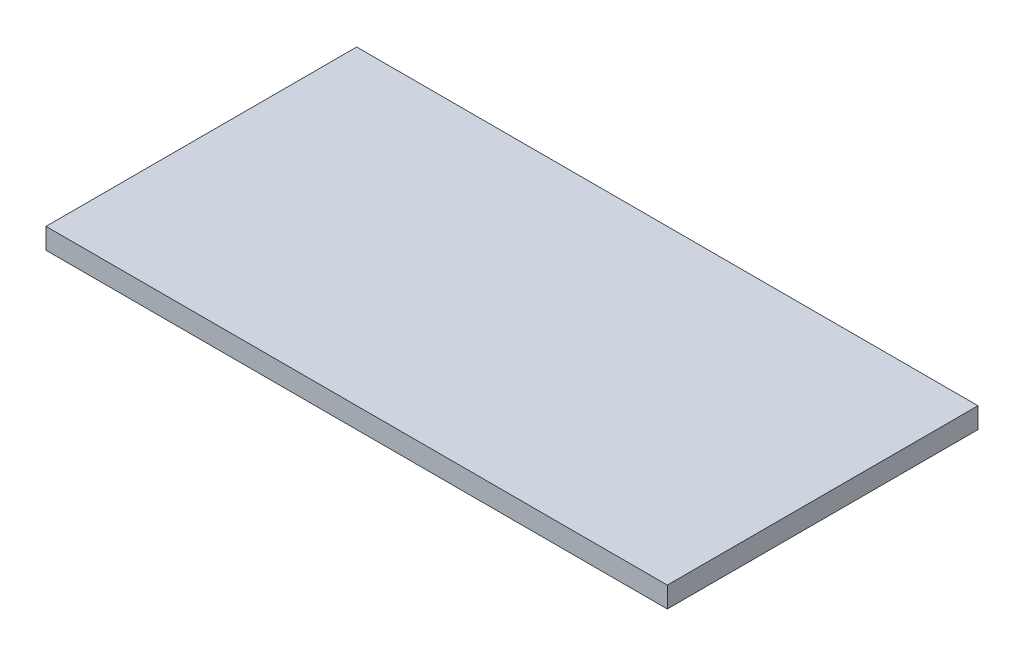
ISO-10303-21;
HEADER;
FILE_DESCRIPTION(('STEP AP214'),'2;1');
FILE_NAME('part.step','',(''),(''),'','','');
FILE_SCHEMA(('AUTOMOTIVE_DESIGN { 1 0 10303 214 1 1 1 1 }'));
ENDSEC;
DATA;
#1=APPLICATION_CONTEXT('core data for automotive mechanical design processes');
#2=APPLICATION_PROTOCOL_DEFINITION('international standard','automotive_design',2000,#1);
#3=PRODUCT_CONTEXT('',#1,'mechanical');
#4=PRODUCT('Part','Part','',(#3));
#5=PRODUCT_RELATED_PRODUCT_CATEGORY('part','',(#4));
#6=PRODUCT_DEFINITION_FORMATION('','',#4);
#7=PRODUCT_DEFINITION_CONTEXT('part definition',#1,'design');
#8=PRODUCT_DEFINITION('design','',#6,#7);
#9=PRODUCT_DEFINITION_SHAPE('','',#8);
#10=(LENGTH_UNIT() NAMED_UNIT(*) SI_UNIT(.MILLI.,.METRE.));
#11=(NAMED_UNIT(*) PLANE_ANGLE_UNIT() SI_UNIT($,.RADIAN.));
#12=(NAMED_UNIT(*) SI_UNIT($,.STERADIAN.) SOLID_ANGLE_UNIT());
#13=UNCERTAINTY_MEASURE_WITH_UNIT(LENGTH_MEASURE(1.E-05),#10,'distance_accuracy_value','');
#14=(GEOMETRIC_REPRESENTATION_CONTEXT(3) GLOBAL_UNCERTAINTY_ASSIGNED_CONTEXT((#13)) GLOBAL_UNIT_ASSIGNED_CONTEXT((#10,
#11,#12)) REPRESENTATION_CONTEXT('',''));
#15=CARTESIAN_POINT('',(0.,0.,0.));
#16=DIRECTION('',(0.,0.,1.));
#17=DIRECTION('',(1.,0.,0.));
#18=AXIS2_PLACEMENT_3D('',#15,#16,#17);
#19=CARTESIAN_POINT('',(-8.287841191067,1.,-3.8833746898263));
#20=DIRECTION('',(1.,0.,0.));
#21=DIRECTION('',(0.,0.,-1.));
#22=AXIS2_PLACEMENT_3D('',#19,#20,#21);
#23=PLANE('',#22);
#24=DIRECTION('',(0.,0.,1.));
#25=VECTOR('',#24,1.);
#26=CARTESIAN_POINT('',(-8.287841191067,0.,-3.8833746898263));
#27=LINE('',#26,#25);
#28=CARTESIAN_POINT('',(-8.287841191067,0.,-3.8833746898263));
#29=VERTEX_POINT('',#28);
#30=CARTESIAN_POINT('',(-8.287841191067,0.,11.1166253101737));
#31=VERTEX_POINT('',#30);
#32=EDGE_CURVE('E97',#29,#31,#27,.T.);
#33=ORIENTED_EDGE('',*,*,#32,.T.);
#34=DIRECTION('',(0.,-1.,0.));
#35=VECTOR('',#34,1.);
#36=CARTESIAN_POINT('',(-8.287841191067,1.,11.1166253101737));
#37=LINE('',#36,#35);
#38=CARTESIAN_POINT('',(-8.287841191067,1.,11.1166253101737));
#39=VERTEX_POINT('',#38);
#40=EDGE_CURVE('E11',#39,#31,#37,.T.);
#41=ORIENTED_EDGE('',*,*,#40,.F.);
#42=DIRECTION('',(0.,0.,1.));
#43=VECTOR('',#42,1.);
#44=CARTESIAN_POINT('',(-8.287841191067,1.,-3.8833746898263));
#45=LINE('',#44,#43);
#46=CARTESIAN_POINT('',(-8.287841191067,1.,-3.8833746898263));
#47=VERTEX_POINT('',#46);
#48=EDGE_CURVE('E85',#47,#39,#45,.T.);
#49=ORIENTED_EDGE('',*,*,#48,.F.);
#50=DIRECTION('',(0.,-1.,0.));
#51=VECTOR('',#50,1.);
#52=CARTESIAN_POINT('',(-8.287841191067,1.,-3.8833746898263));
#53=LINE('',#52,#51);
#54=EDGE_CURVE('E93',#47,#29,#53,.T.);
#55=ORIENTED_EDGE('',*,*,#54,.T.);
#56=EDGE_LOOP('',(#33,#41,#49,#55));
#57=FACE_BOUND('',#56,.T.);
#58=ADVANCED_FACE('F34',(#57),#23,.F.);
#59=CARTESIAN_POINT('',(-8.287841191067,1.,11.1166253101737));
#60=DIRECTION('',(0.,0.,-1.));
#61=DIRECTION('',(-1.,0.,0.));
#62=AXIS2_PLACEMENT_3D('',#59,#60,#61);
#63=PLANE('',#62);
#64=DIRECTION('',(1.,0.,0.));
#65=VECTOR('',#64,1.);
#66=CARTESIAN_POINT('',(-8.287841191067,0.,11.1166253101737));
#67=LINE('',#66,#65);
#68=CARTESIAN_POINT('',(21.712158808933,0.,11.1166253101737));
#69=VERTEX_POINT('',#68);
#70=EDGE_CURVE('E89',#31,#69,#67,.T.);
#71=ORIENTED_EDGE('',*,*,#70,.T.);
#72=DIRECTION('',(0.,-1.,0.));
#73=VECTOR('',#72,1.);
#74=CARTESIAN_POINT('',(21.712158808933,1.,11.1166253101737));
#75=LINE('',#74,#73);
#76=CARTESIAN_POINT('',(21.712158808933,1.,11.1166253101737));
#77=VERTEX_POINT('',#76);
#78=EDGE_CURVE('E42',#77,#69,#75,.T.);
#79=ORIENTED_EDGE('',*,*,#78,.F.);
#80=DIRECTION('',(1.,0.,0.));
#81=VECTOR('',#80,1.);
#82=CARTESIAN_POINT('',(-8.287841191067,1.,11.1166253101737));
#83=LINE('',#82,#81);
#84=EDGE_CURVE('E80',#39,#77,#83,.T.);
#85=ORIENTED_EDGE('',*,*,#84,.F.);
#86=ORIENTED_EDGE('',*,*,#40,.T.);
#87=EDGE_LOOP('',(#71,#79,#85,#86));
#88=FACE_BOUND('',#87,.T.);
#89=ADVANCED_FACE('F88',(#88),#63,.F.);
#90=CARTESIAN_POINT('',(21.712158808933,1.,-3.8833746898263));
#91=DIRECTION('',(-1.,0.,0.));
#92=DIRECTION('',(0.,0.,1.));
#93=AXIS2_PLACEMENT_3D('',#90,#91,#92);
#94=PLANE('',#93);
#95=DIRECTION('',(0.,0.,-1.));
#96=VECTOR('',#95,1.);
#97=CARTESIAN_POINT('',(21.712158808933,0.,-3.8833746898263));
#98=LINE('',#97,#96);
#99=CARTESIAN_POINT('',(21.712158808933,0.,-3.8833746898263));
#100=VERTEX_POINT('',#99);
#101=EDGE_CURVE('E67',#69,#100,#98,.T.);
#102=ORIENTED_EDGE('',*,*,#101,.T.);
#103=DIRECTION('',(0.,-1.,0.));
#104=VECTOR('',#103,1.);
#105=CARTESIAN_POINT('',(21.712158808933,1.,-3.8833746898263));
#106=LINE('',#105,#104);
#107=CARTESIAN_POINT('',(21.712158808933,1.,-3.8833746898263));
#108=VERTEX_POINT('',#107);
#109=EDGE_CURVE('E90',#108,#100,#106,.T.);
#110=ORIENTED_EDGE('',*,*,#109,.F.);
#111=DIRECTION('',(0.,0.,-1.));
#112=VECTOR('',#111,1.);
#113=CARTESIAN_POINT('',(21.712158808933,1.,-3.8833746898263));
#114=LINE('',#113,#112);
#115=EDGE_CURVE('E83',#77,#108,#114,.T.);
#116=ORIENTED_EDGE('',*,*,#115,.F.);
#117=ORIENTED_EDGE('',*,*,#78,.T.);
#118=EDGE_LOOP('',(#102,#110,#116,#117));
#119=FACE_BOUND('',#118,.T.);
#120=ADVANCED_FACE('F91',(#119),#94,.F.);
#121=CARTESIAN_POINT('',(-8.287841191067,1.,-3.8833746898263));
#122=DIRECTION('',(0.,0.,1.));
#123=DIRECTION('',(1.,0.,0.));
#124=AXIS2_PLACEMENT_3D('',#121,#122,#123);
#125=PLANE('',#124);
#126=DIRECTION('',(-1.,0.,0.));
#127=VECTOR('',#126,1.);
#128=CARTESIAN_POINT('',(-8.287841191067,0.,-3.8833746898263));
#129=LINE('',#128,#127);
#130=EDGE_CURVE('E73',#100,#29,#129,.T.);
#131=ORIENTED_EDGE('',*,*,#130,.T.);
#132=ORIENTED_EDGE('',*,*,#54,.F.);
#133=DIRECTION('',(-1.,0.,0.));
#134=VECTOR('',#133,1.);
#135=CARTESIAN_POINT('',(-8.287841191067,1.,-3.8833746898263));
#136=LINE('',#135,#134);
#137=EDGE_CURVE('E50',#108,#47,#136,.T.);
#138=ORIENTED_EDGE('',*,*,#137,.F.);
#139=ORIENTED_EDGE('',*,*,#109,.T.);
#140=EDGE_LOOP('',(#131,#132,#138,#139));
#141=FACE_BOUND('',#140,.T.);
#142=ADVANCED_FACE('F104',(#141),#125,.F.);
#143=CARTESIAN_POINT('',(0.,1.,0.));
#144=DIRECTION('',(0.,1.,0.));
#145=DIRECTION('',(0.,0.,1.));
#146=AXIS2_PLACEMENT_3D('',#143,#144,#145);
#147=PLANE('',#146);
#148=ORIENTED_EDGE('',*,*,#48,.T.);
#149=ORIENTED_EDGE('',*,*,#84,.T.);
#150=ORIENTED_EDGE('',*,*,#115,.T.);
#151=ORIENTED_EDGE('',*,*,#137,.T.);
#152=EDGE_LOOP('',(#148,#149,#150,#151));
#153=FACE_BOUND('',#152,.T.);
#154=ADVANCED_FACE('F81',(#153),#147,.T.);
#155=CARTESIAN_POINT('',(0.,0.,0.));
#156=DIRECTION('',(0.,1.,0.));
#157=DIRECTION('',(0.,0.,1.));
#158=AXIS2_PLACEMENT_3D('',#155,#156,#157);
#159=PLANE('',#158);
#160=ORIENTED_EDGE('',*,*,#32,.F.);
#161=ORIENTED_EDGE('',*,*,#130,.F.);
#162=ORIENTED_EDGE('',*,*,#101,.F.);
#163=ORIENTED_EDGE('',*,*,#70,.F.);
#164=EDGE_LOOP('',(#160,#161,#162,#163));
#165=FACE_BOUND('',#164,.T.);
#166=ADVANCED_FACE('F107',(#165),#159,.F.);
#167=CLOSED_SHELL('',(#58,#89,#120,#142,#154,#166));
#168=MANIFOLD_SOLID_BREP('B2',#167);
#169=ADVANCED_BREP_SHAPE_REPRESENTATION('',(#18,#168),#14);
#170=SHAPE_DEFINITION_REPRESENTATION(#9,#169);
ENDSEC;
END-ISO-10303-21;
